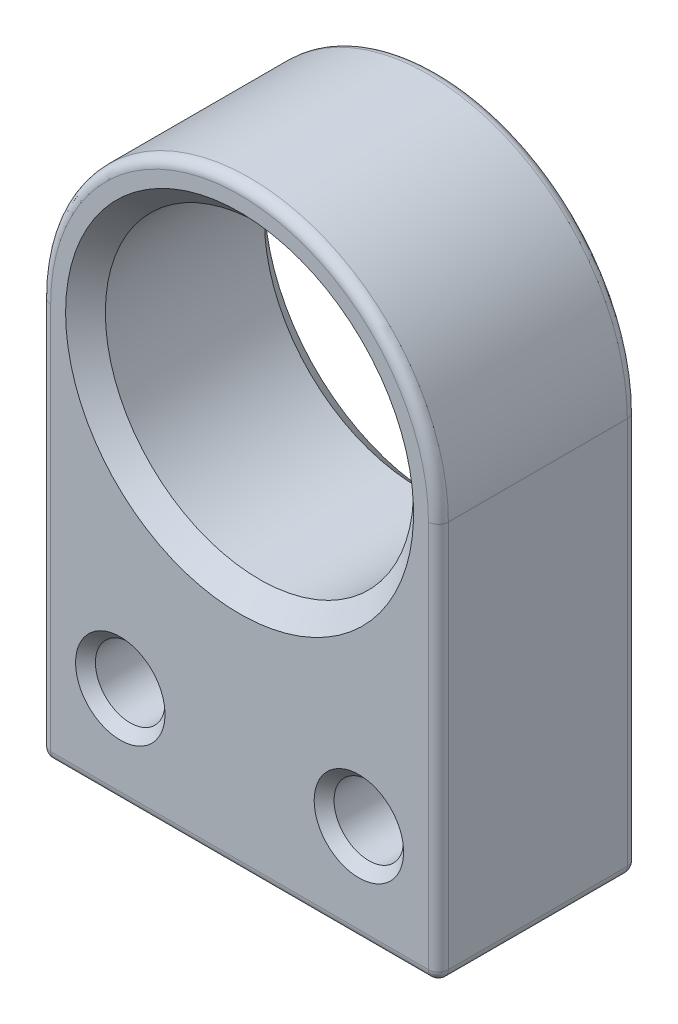
ISO-10303-21;
HEADER;
FILE_DESCRIPTION(('STEP AP214'),'2;1');
FILE_NAME('part.step','',(''),(''),'','','');
FILE_SCHEMA(('AUTOMOTIVE_DESIGN { 1 0 10303 214 1 1 1 1 }'));
ENDSEC;
DATA;
#1=APPLICATION_CONTEXT('core data for automotive mechanical design processes');
#2=APPLICATION_PROTOCOL_DEFINITION('international standard','automotive_design',2000,#1);
#3=PRODUCT_CONTEXT('',#1,'mechanical');
#4=PRODUCT('Part','Part','',(#3));
#5=PRODUCT_RELATED_PRODUCT_CATEGORY('part','',(#4));
#6=PRODUCT_DEFINITION_FORMATION('','',#4);
#7=PRODUCT_DEFINITION_CONTEXT('part definition',#1,'design');
#8=PRODUCT_DEFINITION('design','',#6,#7);
#9=PRODUCT_DEFINITION_SHAPE('','',#8);
#10=(LENGTH_UNIT() NAMED_UNIT(*) SI_UNIT(.MILLI.,.METRE.));
#11=(NAMED_UNIT(*) PLANE_ANGLE_UNIT() SI_UNIT($,.RADIAN.));
#12=(NAMED_UNIT(*) SI_UNIT($,.STERADIAN.) SOLID_ANGLE_UNIT());
#13=UNCERTAINTY_MEASURE_WITH_UNIT(LENGTH_MEASURE(1.E-05),#10,'distance_accuracy_value','');
#14=(GEOMETRIC_REPRESENTATION_CONTEXT(3) GLOBAL_UNCERTAINTY_ASSIGNED_CONTEXT((#13)) GLOBAL_UNIT_ASSIGNED_CONTEXT((#10,
#11,#12)) REPRESENTATION_CONTEXT('',''));
#15=CARTESIAN_POINT('',(0.,0.,0.));
#16=DIRECTION('',(0.,0.,1.));
#17=DIRECTION('',(1.,0.,0.));
#18=AXIS2_PLACEMENT_3D('',#15,#16,#17);
#19=CARTESIAN_POINT('',(0.,0.,10.));
#20=DIRECTION('',(0.,0.,-1.));
#21=DIRECTION('',(-1.,0.,0.));
#22=AXIS2_PLACEMENT_3D('',#19,#20,#21);
#23=PLANE('',#22);
#24=DIRECTION('',(1.,0.,0.));
#25=VECTOR('',#24,1.);
#26=CARTESIAN_POINT('',(0.,-4.5,10.));
#27=LINE('',#26,#25);
#28=CARTESIAN_POINT('',(-9.5,-4.5,10.));
#29=VERTEX_POINT('',#28);
#30=CARTESIAN_POINT('',(9.5,-4.5,10.));
#31=VERTEX_POINT('',#30);
#32=EDGE_CURVE('E138',#29,#31,#27,.T.);
#33=ORIENTED_EDGE('',*,*,#32,.T.);
#34=DIRECTION('',(0.,1.,0.));
#35=VECTOR('',#34,1.);
#36=CARTESIAN_POINT('',(9.5,0.,10.));
#37=LINE('',#36,#35);
#38=CARTESIAN_POINT('',(9.5,15.,10.));
#39=VERTEX_POINT('',#38);
#40=EDGE_CURVE('E133',#31,#39,#37,.T.);
#41=ORIENTED_EDGE('',*,*,#40,.T.);
#42=CARTESIAN_POINT('',(0.,15.,10.));
#43=DIRECTION('',(0.,0.,-1.));
#44=DIRECTION('',(-1.,0.,0.));
#45=AXIS2_PLACEMENT_3D('',#42,#43,#44);
#46=CIRCLE('',#45,9.5);
#47=CARTESIAN_POINT('',(-9.5,15.,10.));
#48=VERTEX_POINT('',#47);
#49=EDGE_CURVE('E127',#39,#48,#46,.F.);
#50=ORIENTED_EDGE('',*,*,#49,.T.);
#51=DIRECTION('',(0.,-1.,0.));
#52=VECTOR('',#51,1.);
#53=CARTESIAN_POINT('',(-9.5,0.,10.));
#54=LINE('',#53,#52);
#55=EDGE_CURVE('E130',#48,#29,#54,.T.);
#56=ORIENTED_EDGE('',*,*,#55,.T.);
#57=EDGE_LOOP('',(#33,#41,#50,#56));
#58=FACE_BOUND('',#57,.T.);
#59=CARTESIAN_POINT('',(6.,0.,10.));
#60=DIRECTION('',(0.,0.,-1.));
#61=DIRECTION('',(-1.,0.,0.));
#62=AXIS2_PLACEMENT_3D('',#59,#60,#61);
#63=CIRCLE('',#62,2.25000000000001);
#64=CARTESIAN_POINT('',(3.74999999999999,0.,10.));
#65=VERTEX_POINT('',#64);
#66=EDGE_CURVE('E262',#65,#65,#63,.T.);
#67=ORIENTED_EDGE('',*,*,#66,.T.);
#68=EDGE_LOOP('',(#67));
#69=FACE_BOUND('',#68,.T.);
#70=CARTESIAN_POINT('',(-6.,0.,10.));
#71=DIRECTION('',(0.,0.,-1.));
#72=DIRECTION('',(-1.,0.,0.));
#73=AXIS2_PLACEMENT_3D('',#70,#71,#72);
#74=CIRCLE('',#73,2.25000000000001);
#75=CARTESIAN_POINT('',(-8.25000000000001,0.,10.));
#76=VERTEX_POINT('',#75);
#77=EDGE_CURVE('E258',#76,#76,#74,.T.);
#78=ORIENTED_EDGE('',*,*,#77,.T.);
#79=EDGE_LOOP('',(#78));
#80=FACE_BOUND('',#79,.T.);
#81=CARTESIAN_POINT('',(0.,15.,10.));
#82=DIRECTION('',(0.,0.,-1.));
#83=DIRECTION('',(-1.,0.,0.));
#84=AXIS2_PLACEMENT_3D('',#81,#82,#83);
#85=CIRCLE('',#84,8.75000000000001);
#86=CARTESIAN_POINT('',(-8.75000000000001,15.,10.));
#87=VERTEX_POINT('',#86);
#88=EDGE_CURVE('E234',#87,#87,#85,.T.);
#89=ORIENTED_EDGE('',*,*,#88,.T.);
#90=EDGE_LOOP('',(#89));
#91=FACE_BOUND('',#90,.T.);
#92=ADVANCED_FACE('F49',(#58,#69,#80,#91),#23,.F.);
#93=CARTESIAN_POINT('',(0.,0.,0.));
#94=DIRECTION('',(0.,0.,-1.));
#95=DIRECTION('',(-1.,0.,0.));
#96=AXIS2_PLACEMENT_3D('',#93,#94,#95);
#97=PLANE('',#96);
#98=CARTESIAN_POINT('',(0.,15.,0.));
#99=DIRECTION('',(0.,0.,-1.));
#100=DIRECTION('',(-1.,0.,0.));
#101=AXIS2_PLACEMENT_3D('',#98,#99,#100);
#102=CIRCLE('',#101,9.5);
#103=CARTESIAN_POINT('',(-9.5,15.,0.));
#104=VERTEX_POINT('',#103);
#105=CARTESIAN_POINT('',(9.5,15.,0.));
#106=VERTEX_POINT('',#105);
#107=EDGE_CURVE('E297',#104,#106,#102,.T.);
#108=ORIENTED_EDGE('',*,*,#107,.T.);
#109=DIRECTION('',(0.,1.,0.));
#110=VECTOR('',#109,1.);
#111=CARTESIAN_POINT('',(9.5,-5.,0.));
#112=LINE('',#111,#110);
#113=CARTESIAN_POINT('',(9.5,-4.5,0.));
#114=VERTEX_POINT('',#113);
#115=EDGE_CURVE('E300',#106,#114,#112,.F.);
#116=ORIENTED_EDGE('',*,*,#115,.T.);
#117=DIRECTION('',(1.,0.,0.));
#118=VECTOR('',#117,1.);
#119=CARTESIAN_POINT('',(-10.,-4.5,0.));
#120=LINE('',#119,#118);
#121=CARTESIAN_POINT('',(-9.5,-4.5,0.));
#122=VERTEX_POINT('',#121);
#123=EDGE_CURVE('E294',#114,#122,#120,.F.);
#124=ORIENTED_EDGE('',*,*,#123,.T.);
#125=DIRECTION('',(0.,-1.,0.));
#126=VECTOR('',#125,1.);
#127=CARTESIAN_POINT('',(-9.5,15.,0.));
#128=LINE('',#127,#126);
#129=EDGE_CURVE('E291',#122,#104,#128,.F.);
#130=ORIENTED_EDGE('',*,*,#129,.T.);
#131=EDGE_LOOP('',(#108,#116,#124,#130));
#132=FACE_BOUND('',#131,.T.);
#133=CARTESIAN_POINT('',(6.,0.,0.));
#134=DIRECTION('',(0.,0.,-1.));
#135=DIRECTION('',(-1.,0.,0.));
#136=AXIS2_PLACEMENT_3D('',#133,#134,#135);
#137=CIRCLE('',#136,2.25);
#138=CARTESIAN_POINT('',(3.75,0.,0.));
#139=VERTEX_POINT('',#138);
#140=EDGE_CURVE('E246',#139,#139,#137,.F.);
#141=ORIENTED_EDGE('',*,*,#140,.T.);
#142=EDGE_LOOP('',(#141));
#143=FACE_BOUND('',#142,.T.);
#144=CARTESIAN_POINT('',(-6.,0.,0.));
#145=DIRECTION('',(0.,0.,-1.));
#146=DIRECTION('',(-1.,0.,0.));
#147=AXIS2_PLACEMENT_3D('',#144,#145,#146);
#148=CIRCLE('',#147,2.25);
#149=CARTESIAN_POINT('',(-8.25,0.,0.));
#150=VERTEX_POINT('',#149);
#151=EDGE_CURVE('E242',#150,#150,#148,.F.);
#152=ORIENTED_EDGE('',*,*,#151,.T.);
#153=EDGE_LOOP('',(#152));
#154=FACE_BOUND('',#153,.T.);
#155=CARTESIAN_POINT('',(0.,15.,0.));
#156=DIRECTION('',(0.,0.,-1.));
#157=DIRECTION('',(-1.,0.,0.));
#158=AXIS2_PLACEMENT_3D('',#155,#156,#157);
#159=CIRCLE('',#158,8.75);
#160=CARTESIAN_POINT('',(-8.75,15.,0.));
#161=VERTEX_POINT('',#160);
#162=EDGE_CURVE('E238',#161,#161,#159,.F.);
#163=ORIENTED_EDGE('',*,*,#162,.T.);
#164=EDGE_LOOP('',(#163));
#165=FACE_BOUND('',#164,.T.);
#166=ADVANCED_FACE('F359',(#132,#143,#154,#165),#97,.T.);
#167=CARTESIAN_POINT('',(10.,-5.,10.));
#168=DIRECTION('',(-1.,0.,0.));
#169=DIRECTION('',(0.,0.,1.));
#170=AXIS2_PLACEMENT_3D('',#167,#168,#169);
#171=PLANE('',#170);
#172=DIRECTION('',(0.,0.,1.));
#173=VECTOR('',#172,1.);
#174=CARTESIAN_POINT('',(10.,15.,0.));
#175=LINE('',#174,#173);
#176=CARTESIAN_POINT('',(10.,15.,0.5));
#177=VERTEX_POINT('',#176);
#178=CARTESIAN_POINT('',(10.,15.,9.5));
#179=VERTEX_POINT('',#178);
#180=EDGE_CURVE('E209',#177,#179,#175,.T.);
#181=ORIENTED_EDGE('',*,*,#180,.T.);
#182=DIRECTION('',(0.,1.,0.));
#183=VECTOR('',#182,1.);
#184=CARTESIAN_POINT('',(10.,-5.,9.5));
#185=LINE('',#184,#183);
#186=CARTESIAN_POINT('',(10.,-4.5,9.5));
#187=VERTEX_POINT('',#186);
#188=EDGE_CURVE('E283',#179,#187,#185,.F.);
#189=ORIENTED_EDGE('',*,*,#188,.T.);
#190=DIRECTION('',(0.,0.,-1.));
#191=VECTOR('',#190,1.);
#192=CARTESIAN_POINT('',(10.,-4.5,10.));
#193=LINE('',#192,#191);
#194=CARTESIAN_POINT('',(10.,-4.5,0.5));
#195=VERTEX_POINT('',#194);
#196=EDGE_CURVE('E277',#187,#195,#193,.T.);
#197=ORIENTED_EDGE('',*,*,#196,.T.);
#198=DIRECTION('',(0.,1.,0.));
#199=VECTOR('',#198,1.);
#200=CARTESIAN_POINT('',(10.,15.,0.5));
#201=LINE('',#200,#199);
#202=EDGE_CURVE('E280',#195,#177,#201,.T.);
#203=ORIENTED_EDGE('',*,*,#202,.T.);
#204=EDGE_LOOP('',(#181,#189,#197,#203));
#205=FACE_BOUND('',#204,.T.);
#206=ADVANCED_FACE('F324',(#205),#171,.F.);
#207=CARTESIAN_POINT('',(-10.,-5.,10.));
#208=DIRECTION('',(1.,0.,0.));
#209=DIRECTION('',(0.,0.,-1.));
#210=AXIS2_PLACEMENT_3D('',#207,#208,#209);
#211=PLANE('',#210);
#212=DIRECTION('',(0.,0.,-1.));
#213=VECTOR('',#212,1.);
#214=CARTESIAN_POINT('',(-10.,-4.5,10.));
#215=LINE('',#214,#213);
#216=CARTESIAN_POINT('',(-10.,-4.5,0.5));
#217=VERTEX_POINT('',#216);
#218=CARTESIAN_POINT('',(-10.,-4.5,9.5));
#219=VERTEX_POINT('',#218);
#220=EDGE_CURVE('E59',#217,#219,#215,.F.);
#221=ORIENTED_EDGE('',*,*,#220,.T.);
#222=DIRECTION('',(0.,-1.,0.));
#223=VECTOR('',#222,1.);
#224=CARTESIAN_POINT('',(-10.,-5.,9.5));
#225=LINE('',#224,#223);
#226=CARTESIAN_POINT('',(-10.,15.,9.5));
#227=VERTEX_POINT('',#226);
#228=EDGE_CURVE('E11',#219,#227,#225,.F.);
#229=ORIENTED_EDGE('',*,*,#228,.T.);
#230=DIRECTION('',(0.,0.,1.));
#231=VECTOR('',#230,1.);
#232=CARTESIAN_POINT('',(-10.,15.,0.));
#233=LINE('',#232,#231);
#234=CARTESIAN_POINT('',(-10.,15.,0.5));
#235=VERTEX_POINT('',#234);
#236=EDGE_CURVE('E216',#235,#227,#233,.T.);
#237=ORIENTED_EDGE('',*,*,#236,.F.);
#238=DIRECTION('',(0.,-1.,0.));
#239=VECTOR('',#238,1.);
#240=CARTESIAN_POINT('',(-10.,-5.,0.5));
#241=LINE('',#240,#239);
#242=EDGE_CURVE('E70',#235,#217,#241,.T.);
#243=ORIENTED_EDGE('',*,*,#242,.T.);
#244=EDGE_LOOP('',(#221,#229,#237,#243));
#245=FACE_BOUND('',#244,.T.);
#246=ADVANCED_FACE('F364',(#245),#211,.F.);
#247=CARTESIAN_POINT('',(-10.,-5.,10.));
#248=DIRECTION('',(0.,1.,0.));
#249=DIRECTION('',(0.,0.,1.));
#250=AXIS2_PLACEMENT_3D('',#247,#248,#249);
#251=PLANE('',#250);
#252=DIRECTION('',(0.,0.,-1.));
#253=VECTOR('',#252,1.);
#254=CARTESIAN_POINT('',(9.5,-5.,10.));
#255=LINE('',#254,#253);
#256=CARTESIAN_POINT('',(9.5,-5.,0.5));
#257=VERTEX_POINT('',#256);
#258=CARTESIAN_POINT('',(9.5,-5.,9.5));
#259=VERTEX_POINT('',#258);
#260=EDGE_CURVE('E310',#257,#259,#255,.F.);
#261=ORIENTED_EDGE('',*,*,#260,.T.);
#262=DIRECTION('',(1.,0.,0.));
#263=VECTOR('',#262,1.);
#264=CARTESIAN_POINT('',(-10.,-5.,9.5));
#265=LINE('',#264,#263);
#266=CARTESIAN_POINT('',(-9.5,-5.,9.5));
#267=VERTEX_POINT('',#266);
#268=EDGE_CURVE('E313',#259,#267,#265,.F.);
#269=ORIENTED_EDGE('',*,*,#268,.T.);
#270=DIRECTION('',(0.,0.,-1.));
#271=VECTOR('',#270,1.);
#272=CARTESIAN_POINT('',(-9.5,-5.,10.));
#273=LINE('',#272,#271);
#274=CARTESIAN_POINT('',(-9.5,-5.,0.5));
#275=VERTEX_POINT('',#274);
#276=EDGE_CURVE('E304',#267,#275,#273,.T.);
#277=ORIENTED_EDGE('',*,*,#276,.T.);
#278=DIRECTION('',(1.,0.,0.));
#279=VECTOR('',#278,1.);
#280=CARTESIAN_POINT('',(10.,-5.,0.5));
#281=LINE('',#280,#279);
#282=EDGE_CURVE('E307',#275,#257,#281,.T.);
#283=ORIENTED_EDGE('',*,*,#282,.T.);
#284=EDGE_LOOP('',(#261,#269,#277,#283));
#285=FACE_BOUND('',#284,.T.);
#286=ADVANCED_FACE('F343',(#285),#251,.F.);
#287=CARTESIAN_POINT('',(-6.,0.,10.));
#288=DIRECTION('',(0.,0.,-1.));
#289=DIRECTION('',(-1.,0.,0.));
#290=AXIS2_PLACEMENT_3D('',#287,#288,#289);
#291=CYLINDRICAL_SURFACE('',#290,1.75);
#292=CARTESIAN_POINT('',(-6.,0.,0.499999999999999));
#293=DIRECTION('',(0.,0.,-1.));
#294=DIRECTION('',(-1.,0.,0.));
#295=AXIS2_PLACEMENT_3D('',#292,#293,#294);
#296=CIRCLE('',#295,1.75);
#297=CARTESIAN_POINT('',(-7.75,0.,0.499999999999999));
#298=VERTEX_POINT('',#297);
#299=EDGE_CURVE('E150',#298,#298,#296,.T.);
#300=ORIENTED_EDGE('',*,*,#299,.T.);
#301=EDGE_LOOP('',(#300));
#302=FACE_BOUND('',#301,.T.);
#303=CARTESIAN_POINT('',(-6.,0.,9.49999999999999));
#304=DIRECTION('',(0.,0.,-1.));
#305=DIRECTION('',(-1.,0.,0.));
#306=AXIS2_PLACEMENT_3D('',#303,#304,#305);
#307=CIRCLE('',#306,1.75);
#308=CARTESIAN_POINT('',(-7.75,0.,9.49999999999999));
#309=VERTEX_POINT('',#308);
#310=EDGE_CURVE('E266',#309,#309,#307,.F.);
#311=ORIENTED_EDGE('',*,*,#310,.T.);
#312=EDGE_LOOP('',(#311));
#313=FACE_BOUND('',#312,.T.);
#314=ADVANCED_FACE('F383',(#302,#313),#291,.F.);
#315=CARTESIAN_POINT('',(6.,0.,10.));
#316=DIRECTION('',(0.,0.,-1.));
#317=DIRECTION('',(-1.,0.,0.));
#318=AXIS2_PLACEMENT_3D('',#315,#316,#317);
#319=CYLINDRICAL_SURFACE('',#318,1.75);
#320=CARTESIAN_POINT('',(6.,0.,0.499999999999999));
#321=DIRECTION('',(0.,0.,-1.));
#322=DIRECTION('',(-1.,0.,0.));
#323=AXIS2_PLACEMENT_3D('',#320,#321,#322);
#324=CIRCLE('',#323,1.75);
#325=CARTESIAN_POINT('',(4.25,0.,0.499999999999999));
#326=VERTEX_POINT('',#325);
#327=EDGE_CURVE('E254',#326,#326,#324,.T.);
#328=ORIENTED_EDGE('',*,*,#327,.T.);
#329=EDGE_LOOP('',(#328));
#330=FACE_BOUND('',#329,.T.);
#331=CARTESIAN_POINT('',(6.,0.,9.49999999999999));
#332=DIRECTION('',(0.,0.,-1.));
#333=DIRECTION('',(-1.,0.,0.));
#334=AXIS2_PLACEMENT_3D('',#331,#332,#333);
#335=CIRCLE('',#334,1.75);
#336=CARTESIAN_POINT('',(4.25,0.,9.49999999999999));
#337=VERTEX_POINT('',#336);
#338=EDGE_CURVE('E250',#337,#337,#335,.F.);
#339=ORIENTED_EDGE('',*,*,#338,.T.);
#340=EDGE_LOOP('',(#339));
#341=FACE_BOUND('',#340,.T.);
#342=ADVANCED_FACE('F579',(#330,#341),#319,.F.);
#343=CARTESIAN_POINT('',(0.,15.,0.));
#344=DIRECTION('',(0.,0.,1.));
#345=DIRECTION('',(1.,0.,0.));
#346=AXIS2_PLACEMENT_3D('',#343,#344,#345);
#347=CYLINDRICAL_SURFACE('',#346,10.);
#348=ORIENTED_EDGE('',*,*,#236,.T.);
#349=CARTESIAN_POINT('',(0.,15.,9.5));
#350=DIRECTION('',(0.,0.,-1.));
#351=DIRECTION('',(-1.,0.,0.));
#352=AXIS2_PLACEMENT_3D('',#349,#350,#351);
#353=CIRCLE('',#352,10.);
#354=EDGE_CURVE('E153',#227,#179,#353,.T.);
#355=ORIENTED_EDGE('',*,*,#354,.T.);
#356=ORIENTED_EDGE('',*,*,#180,.F.);
#357=CARTESIAN_POINT('',(0.,15.,0.5));
#358=DIRECTION('',(0.,0.,-1.));
#359=DIRECTION('',(-1.,0.,0.));
#360=AXIS2_PLACEMENT_3D('',#357,#358,#359);
#361=CIRCLE('',#360,10.);
#362=EDGE_CURVE('E286',#177,#235,#361,.F.);
#363=ORIENTED_EDGE('',*,*,#362,.T.);
#364=EDGE_LOOP('',(#348,#355,#356,#363));
#365=FACE_BOUND('',#364,.T.);
#366=ADVANCED_FACE('F363',(#365),#347,.T.);
#367=CARTESIAN_POINT('',(0.,15.,0.));
#368=DIRECTION('',(0.,0.,1.));
#369=DIRECTION('',(1.,0.,0.));
#370=AXIS2_PLACEMENT_3D('',#367,#368,#369);
#371=CYLINDRICAL_SURFACE('',#370,7.75);
#372=CARTESIAN_POINT('',(0.,15.,8.99999999999999));
#373=DIRECTION('',(0.,0.,-1.));
#374=DIRECTION('',(-1.,0.,0.));
#375=AXIS2_PLACEMENT_3D('',#372,#373,#374);
#376=CIRCLE('',#375,7.75);
#377=CARTESIAN_POINT('',(-7.75,15.,8.99999999999999));
#378=VERTEX_POINT('',#377);
#379=EDGE_CURVE('E230',#378,#378,#376,.F.);
#380=ORIENTED_EDGE('',*,*,#379,.T.);
#381=EDGE_LOOP('',(#380));
#382=FACE_BOUND('',#381,.T.);
#383=CARTESIAN_POINT('',(0.,15.,1.));
#384=DIRECTION('',(0.,0.,-1.));
#385=DIRECTION('',(-1.,0.,0.));
#386=AXIS2_PLACEMENT_3D('',#383,#384,#385);
#387=CIRCLE('',#386,7.75);
#388=CARTESIAN_POINT('',(-7.75,15.,1.));
#389=VERTEX_POINT('',#388);
#390=EDGE_CURVE('E224',#389,#389,#387,.T.);
#391=ORIENTED_EDGE('',*,*,#390,.T.);
#392=EDGE_LOOP('',(#391));
#393=FACE_BOUND('',#392,.T.);
#394=ADVANCED_FACE('F400',(#382,#393),#371,.F.);
#395=CARTESIAN_POINT('',(0.,15.,8.99999999999999));
#396=DIRECTION('',(0.,0.,1.));
#397=DIRECTION('',(1.,0.,0.));
#398=AXIS2_PLACEMENT_3D('',#395,#396,#397);
#399=CONICAL_SURFACE('',#398,7.75,0.78539816339745);
#400=ORIENTED_EDGE('',*,*,#88,.F.);
#401=EDGE_LOOP('',(#400));
#402=FACE_BOUND('',#401,.T.);
#403=ORIENTED_EDGE('',*,*,#379,.F.);
#404=EDGE_LOOP('',(#403));
#405=FACE_BOUND('',#404,.T.);
#406=ADVANCED_FACE('F393',(#402,#405),#399,.F.);
#407=CARTESIAN_POINT('',(0.,15.,0.));
#408=DIRECTION('',(0.,0.,-1.));
#409=DIRECTION('',(-1.,0.,0.));
#410=AXIS2_PLACEMENT_3D('',#407,#408,#409);
#411=CONICAL_SURFACE('',#410,8.75,0.785398163397448);
#412=ORIENTED_EDGE('',*,*,#390,.F.);
#413=EDGE_LOOP('',(#412));
#414=FACE_BOUND('',#413,.T.);
#415=ORIENTED_EDGE('',*,*,#162,.F.);
#416=EDGE_LOOP('',(#415));
#417=FACE_BOUND('',#416,.T.);
#418=ADVANCED_FACE('F399',(#414,#417),#411,.F.);
#419=CARTESIAN_POINT('',(6.,0.,0.));
#420=DIRECTION('',(0.,0.,-1.));
#421=DIRECTION('',(-1.,0.,0.));
#422=AXIS2_PLACEMENT_3D('',#419,#420,#421);
#423=CONICAL_SURFACE('',#422,2.25,0.785398163397448);
#424=ORIENTED_EDGE('',*,*,#327,.F.);
#425=EDGE_LOOP('',(#424));
#426=FACE_BOUND('',#425,.T.);
#427=ORIENTED_EDGE('',*,*,#140,.F.);
#428=EDGE_LOOP('',(#427));
#429=FACE_BOUND('',#428,.T.);
#430=ADVANCED_FACE('F407',(#426,#429),#423,.F.);
#431=CARTESIAN_POINT('',(6.,0.,9.49999999999999));
#432=DIRECTION('',(0.,0.,1.));
#433=DIRECTION('',(1.,0.,0.));
#434=AXIS2_PLACEMENT_3D('',#431,#432,#433);
#435=CONICAL_SURFACE('',#434,1.75,0.785398163397446);
#436=ORIENTED_EDGE('',*,*,#66,.F.);
#437=EDGE_LOOP('',(#436));
#438=FACE_BOUND('',#437,.T.);
#439=ORIENTED_EDGE('',*,*,#338,.F.);
#440=EDGE_LOOP('',(#439));
#441=FACE_BOUND('',#440,.T.);
#442=ADVANCED_FACE('F414',(#438,#441),#435,.F.);
#443=CARTESIAN_POINT('',(-6.,0.,0.));
#444=DIRECTION('',(0.,0.,-1.));
#445=DIRECTION('',(-1.,0.,0.));
#446=AXIS2_PLACEMENT_3D('',#443,#444,#445);
#447=CONICAL_SURFACE('',#446,2.25,0.785398163397448);
#448=ORIENTED_EDGE('',*,*,#299,.F.);
#449=EDGE_LOOP('',(#448));
#450=FACE_BOUND('',#449,.T.);
#451=ORIENTED_EDGE('',*,*,#151,.F.);
#452=EDGE_LOOP('',(#451));
#453=FACE_BOUND('',#452,.T.);
#454=ADVANCED_FACE('F373',(#450,#453),#447,.F.);
#455=CARTESIAN_POINT('',(-6.,0.,9.49999999999999));
#456=DIRECTION('',(0.,0.,1.));
#457=DIRECTION('',(1.,0.,0.));
#458=AXIS2_PLACEMENT_3D('',#455,#456,#457);
#459=CONICAL_SURFACE('',#458,1.75,0.785398163397446);
#460=ORIENTED_EDGE('',*,*,#77,.F.);
#461=EDGE_LOOP('',(#460));
#462=FACE_BOUND('',#461,.T.);
#463=ORIENTED_EDGE('',*,*,#310,.F.);
#464=EDGE_LOOP('',(#463));
#465=FACE_BOUND('',#464,.T.);
#466=ADVANCED_FACE('F367',(#462,#465),#459,.F.);
#467=CARTESIAN_POINT('',(-9.5,-5.,0.5));
#468=DIRECTION('',(0.,1.,0.));
#469=DIRECTION('',(0.,0.,1.));
#470=AXIS2_PLACEMENT_3D('',#467,#468,#469);
#471=CYLINDRICAL_SURFACE('',#470,0.5);
#472=CARTESIAN_POINT('',(-9.5,-4.5,0.5));
#473=DIRECTION('',(0.,-1.,0.));
#474=DIRECTION('',(0.,0.,-1.));
#475=AXIS2_PLACEMENT_3D('',#472,#473,#474);
#476=CIRCLE('',#475,0.5);
#477=EDGE_CURVE('E201',#217,#122,#476,.T.);
#478=ORIENTED_EDGE('',*,*,#477,.F.);
#479=ORIENTED_EDGE('',*,*,#242,.F.);
#480=CARTESIAN_POINT('',(-9.5,15.,0.5));
#481=DIRECTION('',(0.,1.,0.));
#482=DIRECTION('',(0.,0.,1.));
#483=AXIS2_PLACEMENT_3D('',#480,#481,#482);
#484=CIRCLE('',#483,0.5);
#485=EDGE_CURVE('E53',#104,#235,#484,.T.);
#486=ORIENTED_EDGE('',*,*,#485,.F.);
#487=ORIENTED_EDGE('',*,*,#129,.F.);
#488=EDGE_LOOP('',(#478,#479,#486,#487));
#489=FACE_BOUND('',#488,.T.);
#490=ADVANCED_FACE('F51',(#489),#471,.T.);
#491=CARTESIAN_POINT('',(0.,15.,0.5));
#492=DIRECTION('',(0.,0.,-1.));
#493=DIRECTION('',(-1.,0.,0.));
#494=AXIS2_PLACEMENT_3D('',#491,#492,#493);
#495=TOROIDAL_SURFACE('',#494,9.5,0.5);
#496=ORIENTED_EDGE('',*,*,#485,.T.);
#497=ORIENTED_EDGE('',*,*,#362,.F.);
#498=CARTESIAN_POINT('',(9.5,15.,0.5));
#499=DIRECTION('',(0.,-1.,0.));
#500=DIRECTION('',(0.,0.,-1.));
#501=AXIS2_PLACEMENT_3D('',#498,#499,#500);
#502=CIRCLE('',#501,0.5);
#503=EDGE_CURVE('E198',#106,#177,#502,.T.);
#504=ORIENTED_EDGE('',*,*,#503,.F.);
#505=ORIENTED_EDGE('',*,*,#107,.F.);
#506=EDGE_LOOP('',(#496,#497,#504,#505));
#507=FACE_BOUND('',#506,.T.);
#508=ADVANCED_FACE('F361',(#507),#495,.T.);
#509=CARTESIAN_POINT('',(-9.5,-4.5,0.5));
#510=DIRECTION('',(0.,0.,-1.));
#511=DIRECTION('',(-1.,0.,0.));
#512=AXIS2_PLACEMENT_3D('',#509,#510,#511);
#513=SPHERICAL_SURFACE('',#512,0.5);
#514=CARTESIAN_POINT('',(-9.5,-4.5,0.5));
#515=DIRECTION('',(0.,0.,-1.));
#516=DIRECTION('',(-1.,0.,0.));
#517=AXIS2_PLACEMENT_3D('',#514,#515,#516);
#518=CIRCLE('',#517,0.5);
#519=EDGE_CURVE('E190',#217,#275,#518,.F.);
#520=ORIENTED_EDGE('',*,*,#519,.F.);
#521=ORIENTED_EDGE('',*,*,#477,.T.);
#522=CARTESIAN_POINT('',(-9.5,-4.5,0.5));
#523=DIRECTION('',(-1.,0.,0.));
#524=DIRECTION('',(0.,0.,1.));
#525=AXIS2_PLACEMENT_3D('',#522,#523,#524);
#526=CIRCLE('',#525,0.5);
#527=EDGE_CURVE('E194',#275,#122,#526,.F.);
#528=ORIENTED_EDGE('',*,*,#527,.F.);
#529=EDGE_LOOP('',(#520,#521,#528));
#530=FACE_BOUND('',#529,.T.);
#531=ADVANCED_FACE('F354',(#530),#513,.T.);
#532=CARTESIAN_POINT('',(9.5,-5.,0.5));
#533=DIRECTION('',(0.,-1.,0.));
#534=DIRECTION('',(0.,0.,-1.));
#535=AXIS2_PLACEMENT_3D('',#532,#533,#534);
#536=CYLINDRICAL_SURFACE('',#535,0.5);
#537=ORIENTED_EDGE('',*,*,#503,.T.);
#538=ORIENTED_EDGE('',*,*,#202,.F.);
#539=CARTESIAN_POINT('',(9.5,-4.5,0.5));
#540=DIRECTION('',(0.,-1.,0.));
#541=DIRECTION('',(0.,0.,-1.));
#542=AXIS2_PLACEMENT_3D('',#539,#540,#541);
#543=CIRCLE('',#542,0.5);
#544=EDGE_CURVE('E186',#114,#195,#543,.T.);
#545=ORIENTED_EDGE('',*,*,#544,.F.);
#546=ORIENTED_EDGE('',*,*,#115,.F.);
#547=EDGE_LOOP('',(#537,#538,#545,#546));
#548=FACE_BOUND('',#547,.T.);
#549=ADVANCED_FACE('F331',(#548),#536,.T.);
#550=CARTESIAN_POINT('',(-10.,-4.5,0.5));
#551=DIRECTION('',(-1.,0.,0.));
#552=DIRECTION('',(0.,0.,1.));
#553=AXIS2_PLACEMENT_3D('',#550,#551,#552);
#554=CYLINDRICAL_SURFACE('',#553,0.5);
#555=ORIENTED_EDGE('',*,*,#527,.T.);
#556=ORIENTED_EDGE('',*,*,#123,.F.);
#557=CARTESIAN_POINT('',(9.5,-4.5,0.5));
#558=DIRECTION('',(1.,0.,0.));
#559=DIRECTION('',(0.,0.,-1.));
#560=AXIS2_PLACEMENT_3D('',#557,#558,#559);
#561=CIRCLE('',#560,0.5);
#562=EDGE_CURVE('E183',#257,#114,#561,.T.);
#563=ORIENTED_EDGE('',*,*,#562,.F.);
#564=ORIENTED_EDGE('',*,*,#282,.F.);
#565=EDGE_LOOP('',(#555,#556,#563,#564));
#566=FACE_BOUND('',#565,.T.);
#567=ADVANCED_FACE('F356',(#566),#554,.T.);
#568=CARTESIAN_POINT('',(-9.5,-4.5,10.));
#569=DIRECTION('',(0.,0.,-1.));
#570=DIRECTION('',(-1.,0.,0.));
#571=AXIS2_PLACEMENT_3D('',#568,#569,#570);
#572=CYLINDRICAL_SURFACE('',#571,0.5);
#573=ORIENTED_EDGE('',*,*,#519,.T.);
#574=ORIENTED_EDGE('',*,*,#276,.F.);
#575=CARTESIAN_POINT('',(-9.5,-4.5,9.5));
#576=DIRECTION('',(0.,0.,1.));
#577=DIRECTION('',(1.,0.,0.));
#578=AXIS2_PLACEMENT_3D('',#575,#576,#577);
#579=CIRCLE('',#578,0.5);
#580=EDGE_CURVE('E179',#219,#267,#579,.T.);
#581=ORIENTED_EDGE('',*,*,#580,.F.);
#582=ORIENTED_EDGE('',*,*,#220,.F.);
#583=EDGE_LOOP('',(#573,#574,#581,#582));
#584=FACE_BOUND('',#583,.T.);
#585=ADVANCED_FACE('F353',(#584),#572,.T.);
#586=CARTESIAN_POINT('',(9.5,-4.5,0.5));
#587=DIRECTION('',(0.,0.,-1.));
#588=DIRECTION('',(-1.,0.,0.));
#589=AXIS2_PLACEMENT_3D('',#586,#587,#588);
#590=SPHERICAL_SURFACE('',#589,0.5);
#591=ORIENTED_EDGE('',*,*,#562,.T.);
#592=ORIENTED_EDGE('',*,*,#544,.T.);
#593=CARTESIAN_POINT('',(9.5,-4.5,0.5));
#594=DIRECTION('',(0.,0.,-1.));
#595=DIRECTION('',(-1.,0.,0.));
#596=AXIS2_PLACEMENT_3D('',#593,#594,#595);
#597=CIRCLE('',#596,0.5);
#598=EDGE_CURVE('E175',#257,#195,#597,.F.);
#599=ORIENTED_EDGE('',*,*,#598,.F.);
#600=EDGE_LOOP('',(#591,#592,#599));
#601=FACE_BOUND('',#600,.T.);
#602=ADVANCED_FACE('F337',(#601),#590,.T.);
#603=CARTESIAN_POINT('',(-9.5,-4.5,9.5));
#604=DIRECTION('',(0.,-1.,0.));
#605=DIRECTION('',(0.,0.,-1.));
#606=AXIS2_PLACEMENT_3D('',#603,#604,#605);
#607=SPHERICAL_SURFACE('',#606,0.5);
#608=CARTESIAN_POINT('',(-9.5,-4.5,9.5));
#609=DIRECTION('',(0.,-1.,0.));
#610=DIRECTION('',(0.,0.,-1.));
#611=AXIS2_PLACEMENT_3D('',#608,#609,#610);
#612=CIRCLE('',#611,0.5);
#613=EDGE_CURVE('E147',#219,#29,#612,.F.);
#614=ORIENTED_EDGE('',*,*,#613,.F.);
#615=ORIENTED_EDGE('',*,*,#580,.T.);
#616=CARTESIAN_POINT('',(-9.5,-4.5,9.5));
#617=DIRECTION('',(-1.,0.,0.));
#618=DIRECTION('',(0.,0.,1.));
#619=AXIS2_PLACEMENT_3D('',#616,#617,#618);
#620=CIRCLE('',#619,0.5);
#621=EDGE_CURVE('E172',#29,#267,#620,.F.);
#622=ORIENTED_EDGE('',*,*,#621,.F.);
#623=EDGE_LOOP('',(#614,#615,#622));
#624=FACE_BOUND('',#623,.T.);
#625=ADVANCED_FACE('F351',(#624),#607,.T.);
#626=CARTESIAN_POINT('',(9.5,-4.5,10.));
#627=DIRECTION('',(0.,0.,-1.));
#628=DIRECTION('',(-1.,0.,0.));
#629=AXIS2_PLACEMENT_3D('',#626,#627,#628);
#630=CYLINDRICAL_SURFACE('',#629,0.5);
#631=ORIENTED_EDGE('',*,*,#598,.T.);
#632=ORIENTED_EDGE('',*,*,#196,.F.);
#633=CARTESIAN_POINT('',(9.5,-4.5,9.5));
#634=DIRECTION('',(0.,0.,1.));
#635=DIRECTION('',(1.,0.,0.));
#636=AXIS2_PLACEMENT_3D('',#633,#634,#635);
#637=CIRCLE('',#636,0.5);
#638=EDGE_CURVE('E161',#259,#187,#637,.T.);
#639=ORIENTED_EDGE('',*,*,#638,.F.);
#640=ORIENTED_EDGE('',*,*,#260,.F.);
#641=EDGE_LOOP('',(#631,#632,#639,#640));
#642=FACE_BOUND('',#641,.T.);
#643=ADVANCED_FACE('F340',(#642),#630,.T.);
#644=CARTESIAN_POINT('',(0.,-4.5,9.5));
#645=DIRECTION('',(1.,0.,0.));
#646=DIRECTION('',(0.,0.,-1.));
#647=AXIS2_PLACEMENT_3D('',#644,#645,#646);
#648=CYLINDRICAL_SURFACE('',#647,0.5);
#649=ORIENTED_EDGE('',*,*,#621,.T.);
#650=ORIENTED_EDGE('',*,*,#268,.F.);
#651=CARTESIAN_POINT('',(9.5,-4.5,9.5));
#652=DIRECTION('',(1.,0.,0.));
#653=DIRECTION('',(0.,0.,-1.));
#654=AXIS2_PLACEMENT_3D('',#651,#652,#653);
#655=CIRCLE('',#654,0.5);
#656=EDGE_CURVE('E155',#31,#259,#655,.T.);
#657=ORIENTED_EDGE('',*,*,#656,.F.);
#658=ORIENTED_EDGE('',*,*,#32,.F.);
#659=EDGE_LOOP('',(#649,#650,#657,#658));
#660=FACE_BOUND('',#659,.T.);
#661=ADVANCED_FACE('F347',(#660),#648,.T.);
#662=CARTESIAN_POINT('',(-9.5,0.,9.5));
#663=DIRECTION('',(0.,-1.,0.));
#664=DIRECTION('',(0.,0.,-1.));
#665=AXIS2_PLACEMENT_3D('',#662,#663,#664);
#666=CYLINDRICAL_SURFACE('',#665,0.5);
#667=ORIENTED_EDGE('',*,*,#613,.T.);
#668=ORIENTED_EDGE('',*,*,#55,.F.);
#669=CARTESIAN_POINT('',(-9.5,15.,9.5));
#670=DIRECTION('',(0.,1.,0.));
#671=DIRECTION('',(0.,0.,1.));
#672=AXIS2_PLACEMENT_3D('',#669,#670,#671);
#673=CIRCLE('',#672,0.5);
#674=EDGE_CURVE('E144',#227,#48,#673,.T.);
#675=ORIENTED_EDGE('',*,*,#674,.F.);
#676=ORIENTED_EDGE('',*,*,#228,.F.);
#677=EDGE_LOOP('',(#667,#668,#675,#676));
#678=FACE_BOUND('',#677,.T.);
#679=ADVANCED_FACE('F142',(#678),#666,.T.);
#680=CARTESIAN_POINT('',(9.5,-4.5,9.5));
#681=DIRECTION('',(0.,-1.,0.));
#682=DIRECTION('',(0.,0.,-1.));
#683=AXIS2_PLACEMENT_3D('',#680,#681,#682);
#684=SPHERICAL_SURFACE('',#683,0.5);
#685=ORIENTED_EDGE('',*,*,#656,.T.);
#686=ORIENTED_EDGE('',*,*,#638,.T.);
#687=CARTESIAN_POINT('',(9.5,-4.5,9.5));
#688=DIRECTION('',(0.,-1.,0.));
#689=DIRECTION('',(0.,0.,-1.));
#690=AXIS2_PLACEMENT_3D('',#687,#688,#689);
#691=CIRCLE('',#690,0.5);
#692=EDGE_CURVE('E156',#31,#187,#691,.F.);
#693=ORIENTED_EDGE('',*,*,#692,.F.);
#694=EDGE_LOOP('',(#685,#686,#693));
#695=FACE_BOUND('',#694,.T.);
#696=ADVANCED_FACE('F434',(#695),#684,.T.);
#697=CARTESIAN_POINT('',(0.,15.,9.5));
#698=DIRECTION('',(0.,0.,-1.));
#699=DIRECTION('',(-1.,0.,0.));
#700=AXIS2_PLACEMENT_3D('',#697,#698,#699);
#701=TOROIDAL_SURFACE('',#700,9.5,0.5);
#702=ORIENTED_EDGE('',*,*,#674,.T.);
#703=ORIENTED_EDGE('',*,*,#49,.F.);
#704=CARTESIAN_POINT('',(9.5,15.,9.5));
#705=DIRECTION('',(0.,-1.,0.));
#706=DIRECTION('',(0.,0.,-1.));
#707=AXIS2_PLACEMENT_3D('',#704,#705,#706);
#708=CIRCLE('',#707,0.5);
#709=EDGE_CURVE('E163',#179,#39,#708,.T.);
#710=ORIENTED_EDGE('',*,*,#709,.F.);
#711=ORIENTED_EDGE('',*,*,#354,.F.);
#712=EDGE_LOOP('',(#702,#703,#710,#711));
#713=FACE_BOUND('',#712,.T.);
#714=ADVANCED_FACE('F152',(#713),#701,.T.);
#715=CARTESIAN_POINT('',(9.5,0.,9.5));
#716=DIRECTION('',(0.,1.,0.));
#717=DIRECTION('',(0.,0.,1.));
#718=AXIS2_PLACEMENT_3D('',#715,#716,#717);
#719=CYLINDRICAL_SURFACE('',#718,0.5);
#720=ORIENTED_EDGE('',*,*,#692,.T.);
#721=ORIENTED_EDGE('',*,*,#188,.F.);
#722=ORIENTED_EDGE('',*,*,#709,.T.);
#723=ORIENTED_EDGE('',*,*,#40,.F.);
#724=EDGE_LOOP('',(#720,#721,#722,#723));
#725=FACE_BOUND('',#724,.T.);
#726=ADVANCED_FACE('F322',(#725),#719,.T.);
#727=CLOSED_SHELL('',(#92,#166,#206,#246,#286,#314,#342,#366,#394,#406,#418,#430,#442,#454,#466,
#490,#508,#531,#549,#567,#585,#602,#625,#643,#661,#679,#696,#714,#726));
#728=MANIFOLD_SOLID_BREP('B2',#727);
#729=ADVANCED_BREP_SHAPE_REPRESENTATION('',(#18,#728),#14);
#730=SHAPE_DEFINITION_REPRESENTATION(#9,#729);
ENDSEC;
END-ISO-10303-21;
